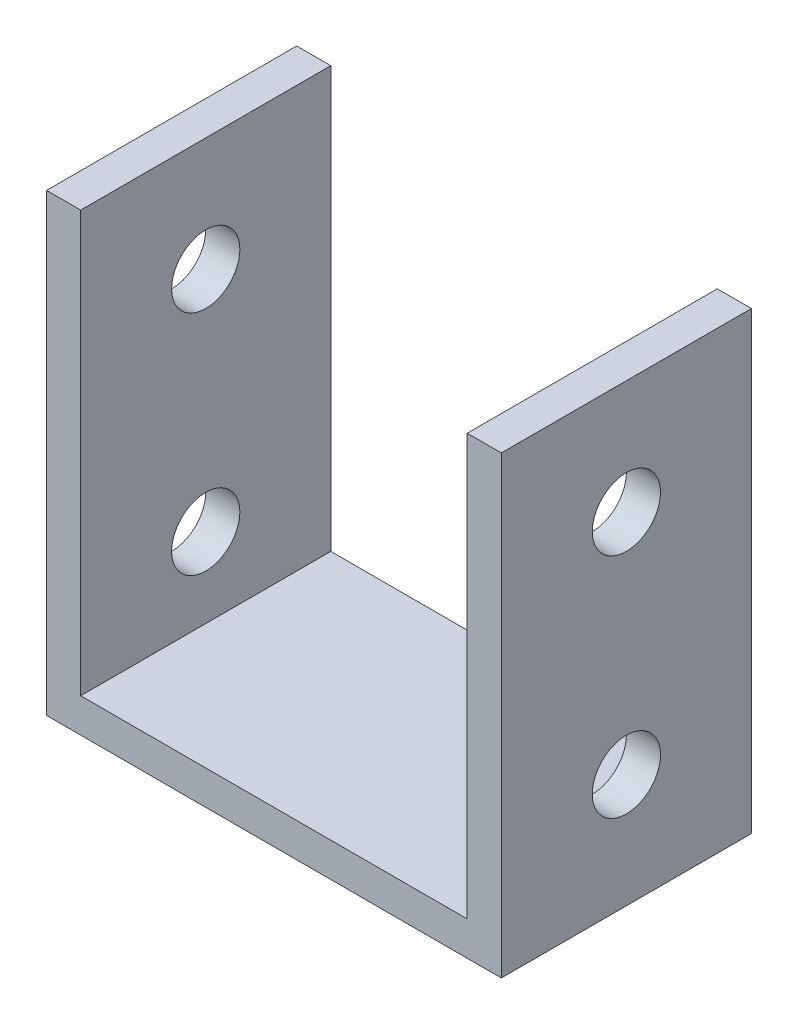
ISO-10303-21;
HEADER;
FILE_DESCRIPTION(('STEP AP214'),'2;1');
FILE_NAME('part.step','',(''),(''),'','','');
FILE_SCHEMA(('AUTOMOTIVE_DESIGN { 1 0 10303 214 1 1 1 1 }'));
ENDSEC;
DATA;
#1=APPLICATION_CONTEXT('core data for automotive mechanical design processes');
#2=APPLICATION_PROTOCOL_DEFINITION('international standard','automotive_design',2000,#1);
#3=PRODUCT_CONTEXT('',#1,'mechanical');
#4=PRODUCT('Part','Part','',(#3));
#5=PRODUCT_RELATED_PRODUCT_CATEGORY('part','',(#4));
#6=PRODUCT_DEFINITION_FORMATION('','',#4);
#7=PRODUCT_DEFINITION_CONTEXT('part definition',#1,'design');
#8=PRODUCT_DEFINITION('design','',#6,#7);
#9=PRODUCT_DEFINITION_SHAPE('','',#8);
#10=(LENGTH_UNIT() NAMED_UNIT(*) SI_UNIT(.MILLI.,.METRE.));
#11=(NAMED_UNIT(*) PLANE_ANGLE_UNIT() SI_UNIT($,.RADIAN.));
#12=(NAMED_UNIT(*) SI_UNIT($,.STERADIAN.) SOLID_ANGLE_UNIT());
#13=UNCERTAINTY_MEASURE_WITH_UNIT(LENGTH_MEASURE(1.E-05),#10,'distance_accuracy_value','');
#14=(GEOMETRIC_REPRESENTATION_CONTEXT(3) GLOBAL_UNCERTAINTY_ASSIGNED_CONTEXT((#13)) GLOBAL_UNIT_ASSIGNED_CONTEXT((#10,
#11,#12)) REPRESENTATION_CONTEXT('',''));
#15=CARTESIAN_POINT('',(0.,0.,0.));
#16=DIRECTION('',(0.,0.,1.));
#17=DIRECTION('',(1.,0.,0.));
#18=AXIS2_PLACEMENT_3D('',#15,#16,#17);
#19=CARTESIAN_POINT('',(-24.1131600640463,22.4990526315789,11.));
#20=DIRECTION('',(0.,-1.,0.));
#21=DIRECTION('',(0.,0.,-1.));
#22=AXIS2_PLACEMENT_3D('',#19,#20,#21);
#23=PLANE('',#22);
#24=DIRECTION('',(-1.,0.,0.));
#25=VECTOR('',#24,1.);
#26=CARTESIAN_POINT('',(-24.1131600640463,22.4990526315789,0.));
#27=LINE('',#26,#25);
#28=CARTESIAN_POINT('',(-24.1131600640463,22.4990526315789,0.));
#29=VERTEX_POINT('',#28);
#30=CARTESIAN_POINT('',(-25.6131600640463,22.4990526315789,0.));
#31=VERTEX_POINT('',#30);
#32=EDGE_CURVE('E128',#29,#31,#27,.T.);
#33=ORIENTED_EDGE('',*,*,#32,.T.);
#34=DIRECTION('',(0.,0.,-1.));
#35=VECTOR('',#34,1.);
#36=CARTESIAN_POINT('',(-25.6131600640463,22.4990526315789,11.));
#37=LINE('',#36,#35);
#38=CARTESIAN_POINT('',(-25.6131600640463,22.4990526315789,11.));
#39=VERTEX_POINT('',#38);
#40=EDGE_CURVE('E11',#39,#31,#37,.T.);
#41=ORIENTED_EDGE('',*,*,#40,.F.);
#42=DIRECTION('',(-1.,0.,0.));
#43=VECTOR('',#42,1.);
#44=CARTESIAN_POINT('',(-24.1131600640463,22.4990526315789,11.));
#45=LINE('',#44,#43);
#46=CARTESIAN_POINT('',(-24.1131600640463,22.4990526315789,11.));
#47=VERTEX_POINT('',#46);
#48=EDGE_CURVE('E143',#47,#39,#45,.T.);
#49=ORIENTED_EDGE('',*,*,#48,.F.);
#50=DIRECTION('',(0.,0.,-1.));
#51=VECTOR('',#50,1.);
#52=CARTESIAN_POINT('',(-24.1131600640463,22.4990526315789,11.));
#53=LINE('',#52,#51);
#54=EDGE_CURVE('E124',#47,#29,#53,.T.);
#55=ORIENTED_EDGE('',*,*,#54,.T.);
#56=EDGE_LOOP('',(#33,#41,#49,#55));
#57=FACE_BOUND('',#56,.T.);
#58=ADVANCED_FACE('F30',(#57),#23,.F.);
#59=CARTESIAN_POINT('',(-25.6131600640463,22.4990526315789,11.));
#60=DIRECTION('',(1.,0.,0.));
#61=DIRECTION('',(0.,1.,0.));
#62=AXIS2_PLACEMENT_3D('',#59,#60,#61);
#63=PLANE('',#62);
#64=CARTESIAN_POINT('',(-25.6131600640463,17.4990526315789,5.5));
#65=DIRECTION('',(1.,0.,0.));
#66=DIRECTION('',(0.,0.,-1.));
#67=AXIS2_PLACEMENT_3D('',#64,#65,#66);
#68=CIRCLE('',#67,1.5);
#69=CARTESIAN_POINT('',(-25.6131600640463,17.4990526315789,4.));
#70=VERTEX_POINT('',#69);
#71=EDGE_CURVE('E285',#70,#70,#68,.T.);
#72=ORIENTED_EDGE('',*,*,#71,.T.);
#73=EDGE_LOOP('',(#72));
#74=FACE_BOUND('',#73,.T.);
#75=CARTESIAN_POINT('',(-25.6131600640463,7.49905263157895,5.5));
#76=DIRECTION('',(1.,0.,0.));
#77=DIRECTION('',(0.,0.,-1.));
#78=AXIS2_PLACEMENT_3D('',#75,#76,#77);
#79=CIRCLE('',#78,1.5);
#80=CARTESIAN_POINT('',(-25.6131600640463,7.49905263157895,4.));
#81=VERTEX_POINT('',#80);
#82=EDGE_CURVE('E156',#81,#81,#79,.T.);
#83=ORIENTED_EDGE('',*,*,#82,.T.);
#84=EDGE_LOOP('',(#83));
#85=FACE_BOUND('',#84,.T.);
#86=DIRECTION('',(0.,-1.,0.));
#87=VECTOR('',#86,1.);
#88=CARTESIAN_POINT('',(-25.6131600640463,22.4990526315789,0.));
#89=LINE('',#88,#87);
#90=CARTESIAN_POINT('',(-25.6131600640463,2.49905263157895,0.));
#91=VERTEX_POINT('',#90);
#92=EDGE_CURVE('E131',#31,#91,#89,.T.);
#93=ORIENTED_EDGE('',*,*,#92,.T.);
#94=DIRECTION('',(0.,0.,-1.));
#95=VECTOR('',#94,1.);
#96=CARTESIAN_POINT('',(-25.6131600640463,2.49905263157895,11.));
#97=LINE('',#96,#95);
#98=CARTESIAN_POINT('',(-25.6131600640463,2.49905263157895,11.));
#99=VERTEX_POINT('',#98);
#100=EDGE_CURVE('E39',#99,#91,#97,.T.);
#101=ORIENTED_EDGE('',*,*,#100,.F.);
#102=DIRECTION('',(0.,-1.,0.));
#103=VECTOR('',#102,1.);
#104=CARTESIAN_POINT('',(-25.6131600640463,22.4990526315789,11.));
#105=LINE('',#104,#103);
#106=EDGE_CURVE('E91',#39,#99,#105,.T.);
#107=ORIENTED_EDGE('',*,*,#106,.F.);
#108=ORIENTED_EDGE('',*,*,#40,.T.);
#109=EDGE_LOOP('',(#93,#101,#107,#108));
#110=FACE_BOUND('',#109,.T.);
#111=ADVANCED_FACE('F207',(#74,#85,#110),#63,.F.);
#112=CARTESIAN_POINT('',(-25.6131600640463,2.49905263157895,11.));
#113=DIRECTION('',(0.,1.,0.));
#114=DIRECTION('',(0.,0.,1.));
#115=AXIS2_PLACEMENT_3D('',#112,#113,#114);
#116=PLANE('',#115);
#117=DIRECTION('',(1.,0.,0.));
#118=VECTOR('',#117,1.);
#119=CARTESIAN_POINT('',(-25.6131600640463,2.49905263157895,0.));
#120=LINE('',#119,#118);
#121=CARTESIAN_POINT('',(-5.61316006404628,2.49905263157895,0.));
#122=VERTEX_POINT('',#121);
#123=EDGE_CURVE('E134',#91,#122,#120,.T.);
#124=ORIENTED_EDGE('',*,*,#123,.T.);
#125=DIRECTION('',(0.,0.,-1.));
#126=VECTOR('',#125,1.);
#127=CARTESIAN_POINT('',(-5.61316006404628,2.49905263157895,11.));
#128=LINE('',#127,#126);
#129=CARTESIAN_POINT('',(-5.61316006404628,2.49905263157895,11.));
#130=VERTEX_POINT('',#129);
#131=EDGE_CURVE('E150',#130,#122,#128,.T.);
#132=ORIENTED_EDGE('',*,*,#131,.F.);
#133=DIRECTION('',(1.,0.,0.));
#134=VECTOR('',#133,1.);
#135=CARTESIAN_POINT('',(-25.6131600640463,2.49905263157895,11.));
#136=LINE('',#135,#134);
#137=EDGE_CURVE('E174',#99,#130,#136,.T.);
#138=ORIENTED_EDGE('',*,*,#137,.F.);
#139=ORIENTED_EDGE('',*,*,#100,.T.);
#140=EDGE_LOOP('',(#124,#132,#138,#139));
#141=FACE_BOUND('',#140,.T.);
#142=ADVANCED_FACE('F211',(#141),#116,.F.);
#143=CARTESIAN_POINT('',(-5.61316006404628,2.49905263157895,11.));
#144=DIRECTION('',(-1.,0.,0.));
#145=DIRECTION('',(0.,0.,1.));
#146=AXIS2_PLACEMENT_3D('',#143,#144,#145);
#147=PLANE('',#146);
#148=CARTESIAN_POINT('',(-5.61316006404628,17.4990526315789,5.5));
#149=DIRECTION('',(1.,0.,0.));
#150=DIRECTION('',(0.,0.,-1.));
#151=AXIS2_PLACEMENT_3D('',#148,#149,#150);
#152=CIRCLE('',#151,1.5);
#153=CARTESIAN_POINT('',(-5.61316006404628,17.4990526315789,4.));
#154=VERTEX_POINT('',#153);
#155=EDGE_CURVE('E284',#154,#154,#152,.T.);
#156=ORIENTED_EDGE('',*,*,#155,.F.);
#157=EDGE_LOOP('',(#156));
#158=FACE_BOUND('',#157,.T.);
#159=CARTESIAN_POINT('',(-5.61316006404628,7.49905263157895,5.5));
#160=DIRECTION('',(1.,0.,0.));
#161=DIRECTION('',(0.,0.,-1.));
#162=AXIS2_PLACEMENT_3D('',#159,#160,#161);
#163=CIRCLE('',#162,1.5);
#164=CARTESIAN_POINT('',(-5.61316006404628,7.49905263157895,4.));
#165=VERTEX_POINT('',#164);
#166=EDGE_CURVE('E162',#165,#165,#163,.T.);
#167=ORIENTED_EDGE('',*,*,#166,.F.);
#168=EDGE_LOOP('',(#167));
#169=FACE_BOUND('',#168,.T.);
#170=DIRECTION('',(0.,1.,0.));
#171=VECTOR('',#170,1.);
#172=CARTESIAN_POINT('',(-5.61316006404628,2.49905263157895,0.));
#173=LINE('',#172,#171);
#174=CARTESIAN_POINT('',(-5.61316006404628,22.4990526315789,0.));
#175=VERTEX_POINT('',#174);
#176=EDGE_CURVE('E136',#122,#175,#173,.T.);
#177=ORIENTED_EDGE('',*,*,#176,.T.);
#178=DIRECTION('',(0.,0.,-1.));
#179=VECTOR('',#178,1.);
#180=CARTESIAN_POINT('',(-5.61316006404628,22.4990526315789,11.));
#181=LINE('',#180,#179);
#182=CARTESIAN_POINT('',(-5.61316006404628,22.4990526315789,11.));
#183=VERTEX_POINT('',#182);
#184=EDGE_CURVE('E147',#183,#175,#181,.T.);
#185=ORIENTED_EDGE('',*,*,#184,.F.);
#186=DIRECTION('',(0.,1.,0.));
#187=VECTOR('',#186,1.);
#188=CARTESIAN_POINT('',(-5.61316006404628,2.49905263157895,11.));
#189=LINE('',#188,#187);
#190=EDGE_CURVE('E176',#130,#183,#189,.T.);
#191=ORIENTED_EDGE('',*,*,#190,.F.);
#192=ORIENTED_EDGE('',*,*,#131,.T.);
#193=EDGE_LOOP('',(#177,#185,#191,#192));
#194=FACE_BOUND('',#193,.T.);
#195=ADVANCED_FACE('F182',(#158,#169,#194),#147,.F.);
#196=CARTESIAN_POINT('',(-5.61316006404628,22.4990526315789,11.));
#197=DIRECTION('',(0.,-1.,0.));
#198=DIRECTION('',(0.,0.,-1.));
#199=AXIS2_PLACEMENT_3D('',#196,#197,#198);
#200=PLANE('',#199);
#201=DIRECTION('',(-1.,0.,0.));
#202=VECTOR('',#201,1.);
#203=CARTESIAN_POINT('',(-5.61316006404628,22.4990526315789,0.));
#204=LINE('',#203,#202);
#205=CARTESIAN_POINT('',(-7.11316006404628,22.4990526315789,0.));
#206=VERTEX_POINT('',#205);
#207=EDGE_CURVE('E138',#175,#206,#204,.T.);
#208=ORIENTED_EDGE('',*,*,#207,.T.);
#209=DIRECTION('',(0.,0.,-1.));
#210=VECTOR('',#209,1.);
#211=CARTESIAN_POINT('',(-7.11316006404628,22.4990526315789,11.));
#212=LINE('',#211,#210);
#213=CARTESIAN_POINT('',(-7.11316006404628,22.4990526315789,11.));
#214=VERTEX_POINT('',#213);
#215=EDGE_CURVE('E119',#214,#206,#212,.T.);
#216=ORIENTED_EDGE('',*,*,#215,.F.);
#217=DIRECTION('',(-1.,0.,0.));
#218=VECTOR('',#217,1.);
#219=CARTESIAN_POINT('',(-5.61316006404628,22.4990526315789,11.));
#220=LINE('',#219,#218);
#221=EDGE_CURVE('E110',#183,#214,#220,.T.);
#222=ORIENTED_EDGE('',*,*,#221,.F.);
#223=ORIENTED_EDGE('',*,*,#184,.T.);
#224=EDGE_LOOP('',(#208,#216,#222,#223));
#225=FACE_BOUND('',#224,.T.);
#226=ADVANCED_FACE('F186',(#225),#200,.F.);
#227=CARTESIAN_POINT('',(-7.11316006404628,22.4990526315789,11.));
#228=DIRECTION('',(1.,0.,0.));
#229=DIRECTION('',(0.,1.,0.));
#230=AXIS2_PLACEMENT_3D('',#227,#228,#229);
#231=PLANE('',#230);
#232=CARTESIAN_POINT('',(-7.11316006404628,17.4990526315789,5.5));
#233=DIRECTION('',(1.,0.,0.));
#234=DIRECTION('',(0.,1.,0.));
#235=AXIS2_PLACEMENT_3D('',#232,#233,#234);
#236=CIRCLE('',#235,1.5);
#237=CARTESIAN_POINT('',(-7.11316006404629,17.4990526315789,4.));
#238=VERTEX_POINT('',#237);
#239=EDGE_CURVE('E167',#238,#238,#236,.T.);
#240=ORIENTED_EDGE('',*,*,#239,.T.);
#241=EDGE_LOOP('',(#240));
#242=FACE_BOUND('',#241,.T.);
#243=CARTESIAN_POINT('',(-7.11316006404628,7.49905263157895,5.5));
#244=DIRECTION('',(1.,0.,0.));
#245=DIRECTION('',(0.,1.,0.));
#246=AXIS2_PLACEMENT_3D('',#243,#244,#245);
#247=CIRCLE('',#246,1.5);
#248=CARTESIAN_POINT('',(-7.11316006404628,7.49905263157895,4.));
#249=VERTEX_POINT('',#248);
#250=EDGE_CURVE('E132',#249,#249,#247,.T.);
#251=ORIENTED_EDGE('',*,*,#250,.T.);
#252=EDGE_LOOP('',(#251));
#253=FACE_BOUND('',#252,.T.);
#254=DIRECTION('',(0.,-1.,0.));
#255=VECTOR('',#254,1.);
#256=CARTESIAN_POINT('',(-7.11316006404628,22.4990526315789,0.));
#257=LINE('',#256,#255);
#258=CARTESIAN_POINT('',(-7.11316006404628,3.99905263157894,0.));
#259=VERTEX_POINT('',#258);
#260=EDGE_CURVE('E118',#206,#259,#257,.T.);
#261=ORIENTED_EDGE('',*,*,#260,.T.);
#262=DIRECTION('',(0.,0.,-1.));
#263=VECTOR('',#262,1.);
#264=CARTESIAN_POINT('',(-7.11316006404628,3.99905263157894,11.));
#265=LINE('',#264,#263);
#266=CARTESIAN_POINT('',(-7.11316006404628,3.99905263157894,11.));
#267=VERTEX_POINT('',#266);
#268=EDGE_CURVE('E115',#267,#259,#265,.T.);
#269=ORIENTED_EDGE('',*,*,#268,.F.);
#270=DIRECTION('',(0.,-1.,0.));
#271=VECTOR('',#270,1.);
#272=CARTESIAN_POINT('',(-7.11316006404628,22.4990526315789,11.));
#273=LINE('',#272,#271);
#274=EDGE_CURVE('E104',#214,#267,#273,.T.);
#275=ORIENTED_EDGE('',*,*,#274,.F.);
#276=ORIENTED_EDGE('',*,*,#215,.T.);
#277=EDGE_LOOP('',(#261,#269,#275,#276));
#278=FACE_BOUND('',#277,.T.);
#279=ADVANCED_FACE('F116',(#242,#253,#278),#231,.F.);
#280=CARTESIAN_POINT('',(-7.11316006404628,3.99905263157894,11.));
#281=DIRECTION('',(0.,-1.,0.));
#282=DIRECTION('',(0.,0.,-1.));
#283=AXIS2_PLACEMENT_3D('',#280,#281,#282);
#284=PLANE('',#283);
#285=DIRECTION('',(-1.,0.,0.));
#286=VECTOR('',#285,1.);
#287=CARTESIAN_POINT('',(-7.11316006404628,3.99905263157894,0.));
#288=LINE('',#287,#286);
#289=CARTESIAN_POINT('',(-24.1131600640463,3.99905263157894,0.));
#290=VERTEX_POINT('',#289);
#291=EDGE_CURVE('E77',#259,#290,#288,.T.);
#292=ORIENTED_EDGE('',*,*,#291,.T.);
#293=DIRECTION('',(0.,0.,-1.));
#294=VECTOR('',#293,1.);
#295=CARTESIAN_POINT('',(-24.1131600640463,3.99905263157894,11.));
#296=LINE('',#295,#294);
#297=CARTESIAN_POINT('',(-24.1131600640463,3.99905263157894,11.));
#298=VERTEX_POINT('',#297);
#299=EDGE_CURVE('E120',#298,#290,#296,.T.);
#300=ORIENTED_EDGE('',*,*,#299,.F.);
#301=DIRECTION('',(-1.,0.,0.));
#302=VECTOR('',#301,1.);
#303=CARTESIAN_POINT('',(-7.11316006404628,3.99905263157894,11.));
#304=LINE('',#303,#302);
#305=EDGE_CURVE('E108',#267,#298,#304,.T.);
#306=ORIENTED_EDGE('',*,*,#305,.F.);
#307=ORIENTED_EDGE('',*,*,#268,.T.);
#308=EDGE_LOOP('',(#292,#300,#306,#307));
#309=FACE_BOUND('',#308,.T.);
#310=ADVANCED_FACE('F122',(#309),#284,.F.);
#311=CARTESIAN_POINT('',(-24.1131600640463,3.99905263157894,11.));
#312=DIRECTION('',(-1.,0.,0.));
#313=DIRECTION('',(0.,-1.,0.));
#314=AXIS2_PLACEMENT_3D('',#311,#312,#313);
#315=PLANE('',#314);
#316=CARTESIAN_POINT('',(-24.1131600640463,17.4990526315789,5.5));
#317=DIRECTION('',(-1.,0.,0.));
#318=DIRECTION('',(0.,-1.,0.));
#319=AXIS2_PLACEMENT_3D('',#316,#317,#318);
#320=CIRCLE('',#319,1.5);
#321=CARTESIAN_POINT('',(-24.1131600640463,17.4990526315789,4.));
#322=VERTEX_POINT('',#321);
#323=EDGE_CURVE('E33',#322,#322,#320,.T.);
#324=ORIENTED_EDGE('',*,*,#323,.T.);
#325=EDGE_LOOP('',(#324));
#326=FACE_BOUND('',#325,.T.);
#327=CARTESIAN_POINT('',(-24.1131600640463,7.49905263157895,5.5));
#328=DIRECTION('',(-1.,0.,0.));
#329=DIRECTION('',(0.,-1.,0.));
#330=AXIS2_PLACEMENT_3D('',#327,#328,#329);
#331=CIRCLE('',#330,1.5);
#332=CARTESIAN_POINT('',(-24.1131600640463,7.49905263157895,4.));
#333=VERTEX_POINT('',#332);
#334=EDGE_CURVE('E154',#333,#333,#331,.T.);
#335=ORIENTED_EDGE('',*,*,#334,.T.);
#336=EDGE_LOOP('',(#335));
#337=FACE_BOUND('',#336,.T.);
#338=DIRECTION('',(0.,1.,0.));
#339=VECTOR('',#338,1.);
#340=CARTESIAN_POINT('',(-24.1131600640463,3.99905263157894,0.));
#341=LINE('',#340,#339);
#342=EDGE_CURVE('E83',#290,#29,#341,.T.);
#343=ORIENTED_EDGE('',*,*,#342,.T.);
#344=ORIENTED_EDGE('',*,*,#54,.F.);
#345=DIRECTION('',(0.,1.,0.));
#346=VECTOR('',#345,1.);
#347=CARTESIAN_POINT('',(-24.1131600640463,3.99905263157894,11.));
#348=LINE('',#347,#346);
#349=EDGE_CURVE('E48',#298,#47,#348,.T.);
#350=ORIENTED_EDGE('',*,*,#349,.F.);
#351=ORIENTED_EDGE('',*,*,#299,.T.);
#352=EDGE_LOOP('',(#343,#344,#350,#351));
#353=FACE_BOUND('',#352,.T.);
#354=ADVANCED_FACE('F194',(#326,#337,#353),#315,.F.);
#355=CARTESIAN_POINT('',(-25.6131600640463,22.4990526315789,11.));
#356=DIRECTION('',(0.,0.,1.));
#357=DIRECTION('',(1.,0.,0.));
#358=AXIS2_PLACEMENT_3D('',#355,#356,#357);
#359=PLANE('',#358);
#360=ORIENTED_EDGE('',*,*,#48,.T.);
#361=ORIENTED_EDGE('',*,*,#106,.T.);
#362=ORIENTED_EDGE('',*,*,#137,.T.);
#363=ORIENTED_EDGE('',*,*,#190,.T.);
#364=ORIENTED_EDGE('',*,*,#221,.T.);
#365=ORIENTED_EDGE('',*,*,#274,.T.);
#366=ORIENTED_EDGE('',*,*,#305,.T.);
#367=ORIENTED_EDGE('',*,*,#349,.T.);
#368=EDGE_LOOP('',(#360,#361,#362,#363,#364,#365,#366,#367));
#369=FACE_BOUND('',#368,.T.);
#370=ADVANCED_FACE('F106',(#369),#359,.T.);
#371=CARTESIAN_POINT('',(-25.6131600640463,22.4990526315789,0.));
#372=DIRECTION('',(0.,0.,1.));
#373=DIRECTION('',(1.,0.,0.));
#374=AXIS2_PLACEMENT_3D('',#371,#372,#373);
#375=PLANE('',#374);
#376=ORIENTED_EDGE('',*,*,#32,.F.);
#377=ORIENTED_EDGE('',*,*,#342,.F.);
#378=ORIENTED_EDGE('',*,*,#291,.F.);
#379=ORIENTED_EDGE('',*,*,#260,.F.);
#380=ORIENTED_EDGE('',*,*,#207,.F.);
#381=ORIENTED_EDGE('',*,*,#176,.F.);
#382=ORIENTED_EDGE('',*,*,#123,.F.);
#383=ORIENTED_EDGE('',*,*,#92,.F.);
#384=EDGE_LOOP('',(#376,#377,#378,#379,#380,#381,#382,#383));
#385=FACE_BOUND('',#384,.T.);
#386=ADVANCED_FACE('F189',(#385),#375,.F.);
#387=CARTESIAN_POINT('',(-25.6131600640463,7.49905263157895,5.5));
#388=DIRECTION('',(1.,0.,0.));
#389=DIRECTION('',(0.,0.,-1.));
#390=AXIS2_PLACEMENT_3D('',#387,#388,#389);
#391=CYLINDRICAL_SURFACE('',#390,1.5);
#392=CARTESIAN_POINT('',(-25.6131600640463,7.49905263157895,4.));
#393=CARTESIAN_POINT('',(-25.5975350640463,7.49905263157895,4.));
#394=CARTESIAN_POINT('',(-25.5819100640463,7.49905263157895,4.));
#395=CARTESIAN_POINT('',(-25.5506600640463,7.49905263157895,4.));
#396=CARTESIAN_POINT('',(-25.5350350640463,7.49905263157895,4.));
#397=CARTESIAN_POINT('',(-25.5037850640463,7.49905263157895,4.));
#398=CARTESIAN_POINT('',(-25.4881600640463,7.49905263157895,4.));
#399=CARTESIAN_POINT('',(-25.4569100640463,7.49905263157895,4.));
#400=CARTESIAN_POINT('',(-25.4412850640463,7.49905263157895,4.));
#401=CARTESIAN_POINT('',(-25.4100350640463,7.49905263157895,4.));
#402=CARTESIAN_POINT('',(-25.3944100640463,7.49905263157895,4.));
#403=CARTESIAN_POINT('',(-25.3631600640463,7.49905263157895,4.));
#404=CARTESIAN_POINT('',(-25.3475350640463,7.49905263157895,4.));
#405=CARTESIAN_POINT('',(-25.3162850640463,7.49905263157895,4.));
#406=CARTESIAN_POINT('',(-25.3006600640463,7.49905263157895,4.));
#407=CARTESIAN_POINT('',(-25.2694100640463,7.49905263157895,4.));
#408=CARTESIAN_POINT('',(-25.2537850640463,7.49905263157895,4.));
#409=CARTESIAN_POINT('',(-25.2225350640463,7.49905263157895,4.));
#410=CARTESIAN_POINT('',(-25.2069100640463,7.49905263157895,4.));
#411=CARTESIAN_POINT('',(-25.1756600640463,7.49905263157895,4.));
#412=CARTESIAN_POINT('',(-25.1600350640463,7.49905263157895,4.));
#413=CARTESIAN_POINT('',(-25.1287850640463,7.49905263157895,4.));
#414=CARTESIAN_POINT('',(-25.1131600640463,7.49905263157895,4.));
#415=CARTESIAN_POINT('',(-25.0819100640463,7.49905263157895,4.));
#416=CARTESIAN_POINT('',(-25.0662850640463,7.49905263157895,4.));
#417=CARTESIAN_POINT('',(-25.0350350640463,7.49905263157895,4.));
#418=CARTESIAN_POINT('',(-25.0194100640463,7.49905263157895,4.));
#419=CARTESIAN_POINT('',(-24.9881600640463,7.49905263157895,4.));
#420=CARTESIAN_POINT('',(-24.9725350640463,7.49905263157895,4.));
#421=CARTESIAN_POINT('',(-24.9412850640463,7.49905263157895,4.));
#422=CARTESIAN_POINT('',(-24.9256600640463,7.49905263157895,4.));
#423=CARTESIAN_POINT('',(-24.8944100640463,7.49905263157895,4.));
#424=CARTESIAN_POINT('',(-24.8787850640463,7.49905263157895,4.));
#425=CARTESIAN_POINT('',(-24.8475350640463,7.49905263157895,4.));
#426=CARTESIAN_POINT('',(-24.8319100640463,7.49905263157895,4.));
#427=CARTESIAN_POINT('',(-24.8006600640463,7.49905263157895,4.));
#428=CARTESIAN_POINT('',(-24.7850350640463,7.49905263157895,4.));
#429=CARTESIAN_POINT('',(-24.7537850640463,7.49905263157895,4.));
#430=CARTESIAN_POINT('',(-24.7381600640463,7.49905263157895,4.));
#431=CARTESIAN_POINT('',(-24.7069100640463,7.49905263157895,4.));
#432=CARTESIAN_POINT('',(-24.6912850640463,7.49905263157895,4.));
#433=CARTESIAN_POINT('',(-24.6600350640463,7.49905263157895,4.));
#434=CARTESIAN_POINT('',(-24.6444100640463,7.49905263157895,4.));
#435=CARTESIAN_POINT('',(-24.6131600640463,7.49905263157895,4.));
#436=CARTESIAN_POINT('',(-24.5975350640463,7.49905263157895,4.));
#437=CARTESIAN_POINT('',(-24.5662850640463,7.49905263157895,4.));
#438=CARTESIAN_POINT('',(-24.5506600640463,7.49905263157895,4.));
#439=CARTESIAN_POINT('',(-24.5194100640463,7.49905263157895,4.));
#440=CARTESIAN_POINT('',(-24.5037850640463,7.49905263157895,4.));
#441=CARTESIAN_POINT('',(-24.4725350640463,7.49905263157895,4.));
#442=CARTESIAN_POINT('',(-24.4569100640463,7.49905263157895,4.));
#443=CARTESIAN_POINT('',(-24.4256600640463,7.49905263157895,4.));
#444=CARTESIAN_POINT('',(-24.4100350640463,7.49905263157895,4.));
#445=CARTESIAN_POINT('',(-24.3787850640463,7.49905263157895,4.));
#446=CARTESIAN_POINT('',(-24.3631600640463,7.49905263157895,4.));
#447=CARTESIAN_POINT('',(-24.3319100640463,7.49905263157895,4.));
#448=CARTESIAN_POINT('',(-24.3162850640463,7.49905263157895,4.));
#449=CARTESIAN_POINT('',(-24.2850350640463,7.49905263157895,4.));
#450=CARTESIAN_POINT('',(-24.2694100640463,7.49905263157895,4.));
#451=CARTESIAN_POINT('',(-24.2381600640463,7.49905263157895,4.));
#452=CARTESIAN_POINT('',(-24.2225350640463,7.49905263157895,4.));
#453=CARTESIAN_POINT('',(-24.1912850640463,7.49905263157895,4.));
#454=CARTESIAN_POINT('',(-24.1756600640463,7.49905263157895,4.));
#455=CARTESIAN_POINT('',(-24.1444100640463,7.49905263157895,4.));
#456=CARTESIAN_POINT('',(-24.1287850640463,7.49905263157895,4.));
#457=CARTESIAN_POINT('',(-24.1131600640463,7.49905263157895,4.));
#458=B_SPLINE_CURVE_WITH_KNOTS('',3,(#392,#393,#394,#395,#396,#397,#398,#399,#400,#401,#402,
#403,#404,#405,#406,#407,#408,#409,#410,#411,#412,#413,#414,#415,#416,#417,#418,#419,#420,#421,
#422,#423,#424,#425,#426,#427,#428,#429,#430,#431,#432,#433,#434,#435,#436,#437,#438,#439,#440,
#441,#442,#443,#444,#445,#446,#447,#448,#449,#450,#451,#452,#453,#454,#455,#456,#457),
.UNSPECIFIED.,.F.,.F.,(4,2,2,2,2,2,2,2,2,2,2,2,2,2,2,2,2,2,2,2,2,2,2,2,2,2,2,2,2,2,2,2,4),(0.,
0.0468750000000018,0.0937500000000036,0.140625000000002,0.187500000000004,0.234375000000002,
0.281250000000004,0.328125000000002,0.375000000000004,0.421875000000002,0.468750000000004,
0.515625000000002,0.562500000000004,0.609375000000002,0.656250000000004,0.703125000000002,
0.750000000000004,0.796875000000006,0.843750000000004,0.890625000000006,0.937500000000004,
0.984375000000006,1.03125,1.07812500000001,1.125,1.17187500000001,1.21875,1.26562500000001,
1.3125,1.35937500000001,1.40625000000001,1.45312500000001,1.50000000000001),.UNSPECIFIED.);
#459=EDGE_CURVE('BSEAM237',#81,#333,#458,.T.);
#460=ORIENTED_EDGE('',*,*,#82,.F.);
#461=ORIENTED_EDGE('',*,*,#334,.F.);
#462=ORIENTED_EDGE('',*,*,#459,.T.);
#463=ORIENTED_EDGE('',*,*,#459,.F.);
#464=EDGE_LOOP('',(#460,#462,#461,#463));
#465=FACE_BOUND('',#464,.T.);
#466=ADVANCED_FACE('F237',(#465),#391,.F.);
#467=CARTESIAN_POINT('',(-5.61316006404628,7.49905263157895,4.));
#468=CARTESIAN_POINT('',(-5.62878506404628,7.49905263157895,4.));
#469=CARTESIAN_POINT('',(-5.64441006404628,7.49905263157895,4.));
#470=CARTESIAN_POINT('',(-5.67566006404628,7.49905263157895,4.));
#471=CARTESIAN_POINT('',(-5.69128506404628,7.49905263157895,4.));
#472=CARTESIAN_POINT('',(-5.72253506404628,7.49905263157895,4.));
#473=CARTESIAN_POINT('',(-5.73816006404628,7.49905263157895,4.));
#474=CARTESIAN_POINT('',(-5.76941006404628,7.49905263157895,4.));
#475=CARTESIAN_POINT('',(-5.78503506404628,7.49905263157895,4.));
#476=CARTESIAN_POINT('',(-5.81628506404628,7.49905263157895,4.));
#477=CARTESIAN_POINT('',(-5.83191006404628,7.49905263157895,4.));
#478=CARTESIAN_POINT('',(-5.86316006404628,7.49905263157895,4.));
#479=CARTESIAN_POINT('',(-5.87878506404628,7.49905263157895,4.));
#480=CARTESIAN_POINT('',(-5.91003506404628,7.49905263157895,4.));
#481=CARTESIAN_POINT('',(-5.92566006404628,7.49905263157895,4.));
#482=CARTESIAN_POINT('',(-5.95691006404628,7.49905263157895,4.));
#483=CARTESIAN_POINT('',(-5.97253506404628,7.49905263157895,4.));
#484=CARTESIAN_POINT('',(-6.00378506404628,7.49905263157895,4.));
#485=CARTESIAN_POINT('',(-6.01941006404628,7.49905263157895,4.));
#486=CARTESIAN_POINT('',(-6.05066006404628,7.49905263157895,4.));
#487=CARTESIAN_POINT('',(-6.06628506404628,7.49905263157895,4.));
#488=CARTESIAN_POINT('',(-6.09753506404628,7.49905263157895,4.));
#489=CARTESIAN_POINT('',(-6.11316006404628,7.49905263157895,4.));
#490=CARTESIAN_POINT('',(-6.14441006404628,7.49905263157895,4.));
#491=CARTESIAN_POINT('',(-6.16003506404628,7.49905263157895,4.));
#492=CARTESIAN_POINT('',(-6.19128506404628,7.49905263157895,4.));
#493=CARTESIAN_POINT('',(-6.20691006404628,7.49905263157895,4.));
#494=CARTESIAN_POINT('',(-6.23816006404628,7.49905263157895,4.));
#495=CARTESIAN_POINT('',(-6.25378506404628,7.49905263157895,4.));
#496=CARTESIAN_POINT('',(-6.28503506404628,7.49905263157895,4.));
#497=CARTESIAN_POINT('',(-6.30066006404628,7.49905263157895,4.));
#498=CARTESIAN_POINT('',(-6.33191006404628,7.49905263157895,4.));
#499=CARTESIAN_POINT('',(-6.34753506404628,7.49905263157895,4.));
#500=CARTESIAN_POINT('',(-6.37878506404628,7.49905263157895,4.));
#501=CARTESIAN_POINT('',(-6.39441006404628,7.49905263157895,4.));
#502=CARTESIAN_POINT('',(-6.42566006404628,7.49905263157895,4.));
#503=CARTESIAN_POINT('',(-6.44128506404628,7.49905263157895,4.));
#504=CARTESIAN_POINT('',(-6.47253506404628,7.49905263157895,4.));
#505=CARTESIAN_POINT('',(-6.48816006404628,7.49905263157895,4.));
#506=CARTESIAN_POINT('',(-6.51941006404628,7.49905263157895,4.));
#507=CARTESIAN_POINT('',(-6.53503506404628,7.49905263157895,4.));
#508=CARTESIAN_POINT('',(-6.56628506404628,7.49905263157895,4.));
#509=CARTESIAN_POINT('',(-6.58191006404628,7.49905263157895,4.));
#510=CARTESIAN_POINT('',(-6.61316006404628,7.49905263157895,4.));
#511=CARTESIAN_POINT('',(-6.62878506404628,7.49905263157895,4.));
#512=CARTESIAN_POINT('',(-6.66003506404628,7.49905263157895,4.));
#513=CARTESIAN_POINT('',(-6.67566006404628,7.49905263157895,4.));
#514=CARTESIAN_POINT('',(-6.70691006404628,7.49905263157895,4.));
#515=CARTESIAN_POINT('',(-6.72253506404628,7.49905263157895,4.));
#516=CARTESIAN_POINT('',(-6.75378506404628,7.49905263157895,4.));
#517=CARTESIAN_POINT('',(-6.76941006404628,7.49905263157895,4.));
#518=CARTESIAN_POINT('',(-6.80066006404628,7.49905263157895,4.));
#519=CARTESIAN_POINT('',(-6.81628506404628,7.49905263157895,4.));
#520=CARTESIAN_POINT('',(-6.84753506404628,7.49905263157895,4.));
#521=CARTESIAN_POINT('',(-6.86316006404628,7.49905263157895,4.));
#522=CARTESIAN_POINT('',(-6.89441006404628,7.49905263157895,4.));
#523=CARTESIAN_POINT('',(-6.91003506404628,7.49905263157895,4.));
#524=CARTESIAN_POINT('',(-6.94128506404628,7.49905263157895,4.));
#525=CARTESIAN_POINT('',(-6.95691006404628,7.49905263157895,4.));
#526=CARTESIAN_POINT('',(-6.98816006404628,7.49905263157895,4.));
#527=CARTESIAN_POINT('',(-7.00378506404628,7.49905263157895,4.));
#528=CARTESIAN_POINT('',(-7.03503506404628,7.49905263157895,4.));
#529=CARTESIAN_POINT('',(-7.05066006404628,7.49905263157895,4.));
#530=CARTESIAN_POINT('',(-7.08191006404628,7.49905263157895,4.));
#531=CARTESIAN_POINT('',(-7.09753506404628,7.49905263157895,4.));
#532=CARTESIAN_POINT('',(-7.11316006404628,7.49905263157895,4.));
#533=B_SPLINE_CURVE_WITH_KNOTS('',3,(#467,#468,#469,#470,#471,#472,#473,#474,#475,#476,#477,
#478,#479,#480,#481,#482,#483,#484,#485,#486,#487,#488,#489,#490,#491,#492,#493,#494,#495,#496,
#497,#498,#499,#500,#501,#502,#503,#504,#505,#506,#507,#508,#509,#510,#511,#512,#513,#514,#515,
#516,#517,#518,#519,#520,#521,#522,#523,#524,#525,#526,#527,#528,#529,#530,#531,#532),
.UNSPECIFIED.,.F.,.F.,(4,2,2,2,2,2,2,2,2,2,2,2,2,2,2,2,2,2,2,2,2,2,2,2,2,2,2,2,2,2,2,2,4),(0.,
0.0468749999999983,0.0937500000000001,0.140624999999998,0.1875,0.234374999999998,0.28125,
0.328124999999999,0.375,0.421874999999999,0.468749999999997,0.515624999999999,0.562499999999997,
0.609374999999999,0.656249999999997,0.703124999999999,0.749999999999997,0.796874999999996,
0.843749999999997,0.890624999999996,0.937499999999997,0.984374999999996,1.03125,1.078125,
1.12499999999999,1.171875,1.21874999999999,1.265625,1.31249999999999,1.359375,1.40624999999999,
1.453125,1.49999999999999),.UNSPECIFIED.);
#534=EDGE_CURVE('BSEAM234',#165,#249,#533,.T.);
#535=ORIENTED_EDGE('',*,*,#166,.T.);
#536=ORIENTED_EDGE('',*,*,#250,.F.);
#537=ORIENTED_EDGE('',*,*,#534,.T.);
#538=ORIENTED_EDGE('',*,*,#534,.F.);
#539=EDGE_LOOP('',(#535,#537,#536,#538));
#540=FACE_BOUND('',#539,.T.);
#541=ADVANCED_FACE('F234',(#540),#391,.F.);
#542=CARTESIAN_POINT('',(-25.6131600640463,17.4990526315789,5.5));
#543=DIRECTION('',(1.,0.,0.));
#544=DIRECTION('',(0.,0.,-1.));
#545=AXIS2_PLACEMENT_3D('',#542,#543,#544);
#546=CYLINDRICAL_SURFACE('',#545,1.5);
#547=CARTESIAN_POINT('',(-25.6131600640463,17.4990526315789,4.));
#548=CARTESIAN_POINT('',(-25.5975350640463,17.4990526315789,4.));
#549=CARTESIAN_POINT('',(-25.5819100640463,17.4990526315789,4.));
#550=CARTESIAN_POINT('',(-25.5506600640463,17.4990526315789,4.));
#551=CARTESIAN_POINT('',(-25.5350350640463,17.4990526315789,4.));
#552=CARTESIAN_POINT('',(-25.5037850640463,17.4990526315789,4.));
#553=CARTESIAN_POINT('',(-25.4881600640463,17.4990526315789,4.));
#554=CARTESIAN_POINT('',(-25.4569100640463,17.4990526315789,4.));
#555=CARTESIAN_POINT('',(-25.4412850640463,17.4990526315789,4.));
#556=CARTESIAN_POINT('',(-25.4100350640463,17.4990526315789,4.));
#557=CARTESIAN_POINT('',(-25.3944100640463,17.4990526315789,4.));
#558=CARTESIAN_POINT('',(-25.3631600640463,17.4990526315789,4.));
#559=CARTESIAN_POINT('',(-25.3475350640463,17.4990526315789,4.));
#560=CARTESIAN_POINT('',(-25.3162850640463,17.4990526315789,4.));
#561=CARTESIAN_POINT('',(-25.3006600640463,17.4990526315789,4.));
#562=CARTESIAN_POINT('',(-25.2694100640463,17.4990526315789,4.));
#563=CARTESIAN_POINT('',(-25.2537850640463,17.4990526315789,4.));
#564=CARTESIAN_POINT('',(-25.2225350640463,17.4990526315789,4.));
#565=CARTESIAN_POINT('',(-25.2069100640463,17.4990526315789,4.));
#566=CARTESIAN_POINT('',(-25.1756600640463,17.4990526315789,4.));
#567=CARTESIAN_POINT('',(-25.1600350640463,17.4990526315789,4.));
#568=CARTESIAN_POINT('',(-25.1287850640463,17.4990526315789,4.));
#569=CARTESIAN_POINT('',(-25.1131600640463,17.4990526315789,4.));
#570=CARTESIAN_POINT('',(-25.0819100640463,17.4990526315789,4.));
#571=CARTESIAN_POINT('',(-25.0662850640463,17.4990526315789,4.));
#572=CARTESIAN_POINT('',(-25.0350350640463,17.4990526315789,4.));
#573=CARTESIAN_POINT('',(-25.0194100640463,17.4990526315789,4.));
#574=CARTESIAN_POINT('',(-24.9881600640463,17.4990526315789,4.));
#575=CARTESIAN_POINT('',(-24.9725350640463,17.4990526315789,4.));
#576=CARTESIAN_POINT('',(-24.9412850640463,17.4990526315789,4.));
#577=CARTESIAN_POINT('',(-24.9256600640463,17.4990526315789,4.));
#578=CARTESIAN_POINT('',(-24.8944100640463,17.4990526315789,4.));
#579=CARTESIAN_POINT('',(-24.8787850640463,17.4990526315789,4.));
#580=CARTESIAN_POINT('',(-24.8475350640463,17.4990526315789,4.));
#581=CARTESIAN_POINT('',(-24.8319100640463,17.4990526315789,4.));
#582=CARTESIAN_POINT('',(-24.8006600640463,17.4990526315789,4.));
#583=CARTESIAN_POINT('',(-24.7850350640463,17.4990526315789,4.));
#584=CARTESIAN_POINT('',(-24.7537850640463,17.4990526315789,4.));
#585=CARTESIAN_POINT('',(-24.7381600640463,17.4990526315789,4.));
#586=CARTESIAN_POINT('',(-24.7069100640463,17.4990526315789,4.));
#587=CARTESIAN_POINT('',(-24.6912850640463,17.4990526315789,4.));
#588=CARTESIAN_POINT('',(-24.6600350640463,17.4990526315789,4.));
#589=CARTESIAN_POINT('',(-24.6444100640463,17.4990526315789,4.));
#590=CARTESIAN_POINT('',(-24.6131600640463,17.4990526315789,4.));
#591=CARTESIAN_POINT('',(-24.5975350640463,17.4990526315789,4.));
#592=CARTESIAN_POINT('',(-24.5662850640463,17.4990526315789,4.));
#593=CARTESIAN_POINT('',(-24.5506600640463,17.4990526315789,4.));
#594=CARTESIAN_POINT('',(-24.5194100640463,17.4990526315789,4.));
#595=CARTESIAN_POINT('',(-24.5037850640463,17.4990526315789,4.));
#596=CARTESIAN_POINT('',(-24.4725350640463,17.4990526315789,4.));
#597=CARTESIAN_POINT('',(-24.4569100640463,17.4990526315789,4.));
#598=CARTESIAN_POINT('',(-24.4256600640463,17.4990526315789,4.));
#599=CARTESIAN_POINT('',(-24.4100350640463,17.4990526315789,4.));
#600=CARTESIAN_POINT('',(-24.3787850640463,17.4990526315789,4.));
#601=CARTESIAN_POINT('',(-24.3631600640463,17.4990526315789,4.));
#602=CARTESIAN_POINT('',(-24.3319100640463,17.4990526315789,4.));
#603=CARTESIAN_POINT('',(-24.3162850640463,17.4990526315789,4.));
#604=CARTESIAN_POINT('',(-24.2850350640463,17.4990526315789,4.));
#605=CARTESIAN_POINT('',(-24.2694100640463,17.4990526315789,4.));
#606=CARTESIAN_POINT('',(-24.2381600640463,17.4990526315789,4.));
#607=CARTESIAN_POINT('',(-24.2225350640463,17.4990526315789,4.));
#608=CARTESIAN_POINT('',(-24.1912850640463,17.4990526315789,4.));
#609=CARTESIAN_POINT('',(-24.1756600640463,17.4990526315789,4.));
#610=CARTESIAN_POINT('',(-24.1444100640463,17.4990526315789,4.));
#611=CARTESIAN_POINT('',(-24.1287850640463,17.4990526315789,4.));
#612=CARTESIAN_POINT('',(-24.1131600640463,17.4990526315789,4.));
#613=B_SPLINE_CURVE_WITH_KNOTS('',3,(#547,#548,#549,#550,#551,#552,#553,#554,#555,#556,#557,
#558,#559,#560,#561,#562,#563,#564,#565,#566,#567,#568,#569,#570,#571,#572,#573,#574,#575,#576,
#577,#578,#579,#580,#581,#582,#583,#584,#585,#586,#587,#588,#589,#590,#591,#592,#593,#594,#595,
#596,#597,#598,#599,#600,#601,#602,#603,#604,#605,#606,#607,#608,#609,#610,#611,#612),
.UNSPECIFIED.,.F.,.F.,(4,2,2,2,2,2,2,2,2,2,2,2,2,2,2,2,2,2,2,2,2,2,2,2,2,2,2,2,2,2,2,2,4),(0.,
0.0468750000000018,0.0937500000000001,0.140625000000002,0.1875,0.234375000000002,0.28125,
0.328125000000002,0.375,0.421875000000002,0.46875,0.515625000000002,0.5625,0.609375000000002,
0.656250000000001,0.703125000000002,0.750000000000001,0.796875000000002,0.843750000000001,
0.890625000000003,0.937500000000001,0.984375000000003,1.03125,1.078125,1.125,1.171875,1.21875,
1.265625,1.3125,1.359375,1.40625,1.453125,1.5),.UNSPECIFIED.);
#614=EDGE_CURVE('BSEAM236',#70,#322,#613,.T.);
#615=ORIENTED_EDGE('',*,*,#71,.F.);
#616=ORIENTED_EDGE('',*,*,#323,.F.);
#617=ORIENTED_EDGE('',*,*,#614,.T.);
#618=ORIENTED_EDGE('',*,*,#614,.F.);
#619=EDGE_LOOP('',(#615,#617,#616,#618));
#620=FACE_BOUND('',#619,.T.);
#621=ADVANCED_FACE('F236',(#620),#546,.F.);
#622=CARTESIAN_POINT('',(-5.61316006404628,17.4990526315789,4.));
#623=CARTESIAN_POINT('',(-5.62878506404629,17.4990526315789,4.));
#624=CARTESIAN_POINT('',(-5.64441006404629,17.4990526315789,4.));
#625=CARTESIAN_POINT('',(-5.67566006404629,17.4990526315789,4.));
#626=CARTESIAN_POINT('',(-5.69128506404629,17.4990526315789,4.));
#627=CARTESIAN_POINT('',(-5.72253506404628,17.4990526315789,4.));
#628=CARTESIAN_POINT('',(-5.73816006404628,17.4990526315789,4.));
#629=CARTESIAN_POINT('',(-5.76941006404628,17.4990526315789,4.));
#630=CARTESIAN_POINT('',(-5.78503506404628,17.4990526315789,4.));
#631=CARTESIAN_POINT('',(-5.81628506404629,17.4990526315789,4.));
#632=CARTESIAN_POINT('',(-5.83191006404629,17.4990526315789,4.));
#633=CARTESIAN_POINT('',(-5.86316006404629,17.4990526315789,4.));
#634=CARTESIAN_POINT('',(-5.87878506404629,17.4990526315789,4.));
#635=CARTESIAN_POINT('',(-5.91003506404628,17.4990526315789,4.));
#636=CARTESIAN_POINT('',(-5.92566006404628,17.4990526315789,4.));
#637=CARTESIAN_POINT('',(-5.95691006404628,17.4990526315789,4.));
#638=CARTESIAN_POINT('',(-5.97253506404628,17.4990526315789,4.));
#639=CARTESIAN_POINT('',(-6.00378506404629,17.4990526315789,4.));
#640=CARTESIAN_POINT('',(-6.01941006404629,17.4990526315789,4.));
#641=CARTESIAN_POINT('',(-6.05066006404629,17.4990526315789,4.));
#642=CARTESIAN_POINT('',(-6.06628506404629,17.4990526315789,4.));
#643=CARTESIAN_POINT('',(-6.09753506404628,17.4990526315789,4.));
#644=CARTESIAN_POINT('',(-6.11316006404628,17.4990526315789,4.));
#645=CARTESIAN_POINT('',(-6.14441006404628,17.4990526315789,4.));
#646=CARTESIAN_POINT('',(-6.16003506404628,17.4990526315789,4.));
#647=CARTESIAN_POINT('',(-6.19128506404629,17.4990526315789,4.));
#648=CARTESIAN_POINT('',(-6.20691006404629,17.4990526315789,4.));
#649=CARTESIAN_POINT('',(-6.23816006404629,17.4990526315789,4.));
#650=CARTESIAN_POINT('',(-6.25378506404629,17.4990526315789,4.));
#651=CARTESIAN_POINT('',(-6.28503506404628,17.4990526315789,4.));
#652=CARTESIAN_POINT('',(-6.30066006404628,17.4990526315789,4.));
#653=CARTESIAN_POINT('',(-6.33191006404628,17.4990526315789,4.));
#654=CARTESIAN_POINT('',(-6.34753506404628,17.4990526315789,4.));
#655=CARTESIAN_POINT('',(-6.37878506404629,17.4990526315789,4.));
#656=CARTESIAN_POINT('',(-6.39441006404629,17.4990526315789,4.));
#657=CARTESIAN_POINT('',(-6.42566006404629,17.4990526315789,4.));
#658=CARTESIAN_POINT('',(-6.44128506404629,17.4990526315789,4.));
#659=CARTESIAN_POINT('',(-6.47253506404628,17.4990526315789,4.));
#660=CARTESIAN_POINT('',(-6.48816006404628,17.4990526315789,4.));
#661=CARTESIAN_POINT('',(-6.51941006404628,17.4990526315789,4.));
#662=CARTESIAN_POINT('',(-6.53503506404628,17.4990526315789,4.));
#663=CARTESIAN_POINT('',(-6.56628506404629,17.4990526315789,4.));
#664=CARTESIAN_POINT('',(-6.58191006404629,17.4990526315789,4.));
#665=CARTESIAN_POINT('',(-6.61316006404629,17.4990526315789,4.));
#666=CARTESIAN_POINT('',(-6.62878506404629,17.4990526315789,4.));
#667=CARTESIAN_POINT('',(-6.66003506404628,17.4990526315789,4.));
#668=CARTESIAN_POINT('',(-6.67566006404628,17.4990526315789,4.));
#669=CARTESIAN_POINT('',(-6.70691006404628,17.4990526315789,4.));
#670=CARTESIAN_POINT('',(-6.72253506404628,17.4990526315789,4.));
#671=CARTESIAN_POINT('',(-6.75378506404629,17.4990526315789,4.));
#672=CARTESIAN_POINT('',(-6.76941006404629,17.4990526315789,4.));
#673=CARTESIAN_POINT('',(-6.80066006404629,17.4990526315789,4.));
#674=CARTESIAN_POINT('',(-6.81628506404629,17.4990526315789,4.));
#675=CARTESIAN_POINT('',(-6.84753506404628,17.4990526315789,4.));
#676=CARTESIAN_POINT('',(-6.86316006404628,17.4990526315789,4.));
#677=CARTESIAN_POINT('',(-6.89441006404629,17.4990526315789,4.));
#678=CARTESIAN_POINT('',(-6.91003506404629,17.4990526315789,4.));
#679=CARTESIAN_POINT('',(-6.94128506404629,17.4990526315789,4.));
#680=CARTESIAN_POINT('',(-6.95691006404629,17.4990526315789,4.));
#681=CARTESIAN_POINT('',(-6.98816006404629,17.4990526315789,4.));
#682=CARTESIAN_POINT('',(-7.00378506404629,17.4990526315789,4.));
#683=CARTESIAN_POINT('',(-7.03503506404629,17.4990526315789,4.));
#684=CARTESIAN_POINT('',(-7.05066006404629,17.4990526315789,4.));
#685=CARTESIAN_POINT('',(-7.08191006404629,17.4990526315789,4.));
#686=CARTESIAN_POINT('',(-7.09753506404629,17.4990526315789,4.));
#687=CARTESIAN_POINT('',(-7.11316006404629,17.4990526315789,4.));
#688=B_SPLINE_CURVE_WITH_KNOTS('',3,(#622,#623,#624,#625,#626,#627,#628,#629,#630,#631,#632,
#633,#634,#635,#636,#637,#638,#639,#640,#641,#642,#643,#644,#645,#646,#647,#648,#649,#650,#651,
#652,#653,#654,#655,#656,#657,#658,#659,#660,#661,#662,#663,#664,#665,#666,#667,#668,#669,#670,
#671,#672,#673,#674,#675,#676,#677,#678,#679,#680,#681,#682,#683,#684,#685,#686,#687),
.UNSPECIFIED.,.F.,.F.,(4,2,2,2,2,2,2,2,2,2,2,2,2,2,2,2,2,2,2,2,2,2,2,2,2,2,2,2,2,2,2,2,4),(0.,
0.0468750000000018,0.0937500000000001,0.140624999999998,0.1875,0.234375000000002,0.28125,
0.328124999999999,0.375,0.421875000000002,0.46875,0.515624999999999,0.5625,0.609375000000002,
0.656250000000001,0.703124999999999,0.750000000000001,0.796875000000002,0.843750000000001,
0.890624999999999,0.937500000000001,0.984375000000003,1.03125,1.078125,1.125,1.171875,1.21875,
1.265625,1.3125,1.359375,1.40625,1.453125,1.5),.UNSPECIFIED.);
#689=EDGE_CURVE('BSEAM244',#154,#238,#688,.T.);
#690=ORIENTED_EDGE('',*,*,#155,.T.);
#691=ORIENTED_EDGE('',*,*,#239,.F.);
#692=ORIENTED_EDGE('',*,*,#689,.T.);
#693=ORIENTED_EDGE('',*,*,#689,.F.);
#694=EDGE_LOOP('',(#690,#692,#691,#693));
#695=FACE_BOUND('',#694,.T.);
#696=ADVANCED_FACE('F244',(#695),#546,.F.);
#697=CLOSED_SHELL('',(#58,#111,#142,#195,#226,#279,#310,#354,#370,#386,#466,#541,#621,#696));
#698=MANIFOLD_SOLID_BREP('B2',#697);
#699=ADVANCED_BREP_SHAPE_REPRESENTATION('',(#18,#698),#14);
#700=SHAPE_DEFINITION_REPRESENTATION(#9,#699);
ENDSEC;
END-ISO-10303-21;
